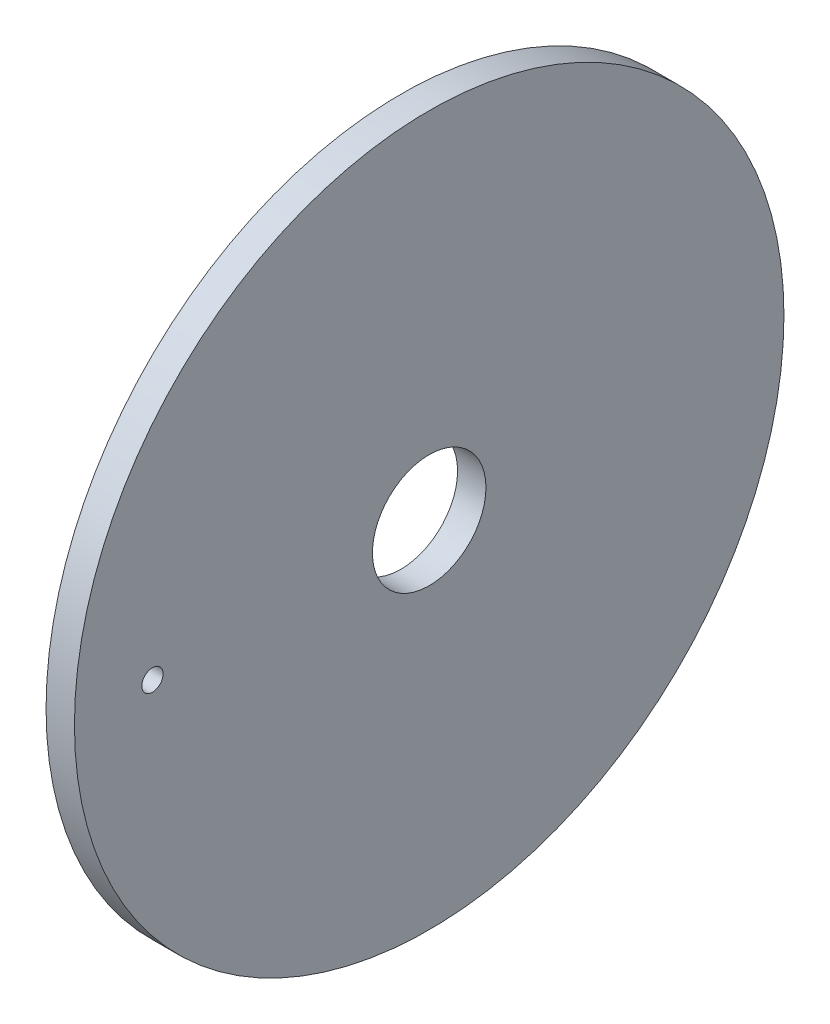
ISO-10303-21;
HEADER;
FILE_DESCRIPTION(('STEP AP214'),'2;1');
FILE_NAME('part.step','',(''),(''),'','','');
FILE_SCHEMA(('AUTOMOTIVE_DESIGN { 1 0 10303 214 1 1 1 1 }'));
ENDSEC;
DATA;
#1=APPLICATION_CONTEXT('core data for automotive mechanical design processes');
#2=APPLICATION_PROTOCOL_DEFINITION('international standard','automotive_design',2000,#1);
#3=PRODUCT_CONTEXT('',#1,'mechanical');
#4=PRODUCT('Part','Part','',(#3));
#5=PRODUCT_RELATED_PRODUCT_CATEGORY('part','',(#4));
#6=PRODUCT_DEFINITION_FORMATION('','',#4);
#7=PRODUCT_DEFINITION_CONTEXT('part definition',#1,'design');
#8=PRODUCT_DEFINITION('design','',#6,#7);
#9=PRODUCT_DEFINITION_SHAPE('','',#8);
#10=(LENGTH_UNIT() NAMED_UNIT(*) SI_UNIT(.MILLI.,.METRE.));
#11=(NAMED_UNIT(*) PLANE_ANGLE_UNIT() SI_UNIT($,.RADIAN.));
#12=(NAMED_UNIT(*) SI_UNIT($,.STERADIAN.) SOLID_ANGLE_UNIT());
#13=UNCERTAINTY_MEASURE_WITH_UNIT(LENGTH_MEASURE(1.E-05),#10,'distance_accuracy_value','');
#14=(GEOMETRIC_REPRESENTATION_CONTEXT(3) GLOBAL_UNCERTAINTY_ASSIGNED_CONTEXT((#13)) GLOBAL_UNIT_ASSIGNED_CONTEXT((#10,
#11,#12)) REPRESENTATION_CONTEXT('',''));
#15=CARTESIAN_POINT('',(0.,0.,0.));
#16=DIRECTION('',(0.,0.,1.));
#17=DIRECTION('',(1.,0.,0.));
#18=AXIS2_PLACEMENT_3D('',#15,#16,#17);
#19=CARTESIAN_POINT('',(2.,0.,0.));
#20=DIRECTION('',(1.,0.,0.));
#21=DIRECTION('',(0.,0.,-1.));
#22=AXIS2_PLACEMENT_3D('',#19,#20,#21);
#23=PLANE('',#22);
#24=CARTESIAN_POINT('',(2.,0.,19.5));
#25=DIRECTION('',(1.,0.,0.));
#26=DIRECTION('',(0.,0.,-1.));
#27=AXIS2_PLACEMENT_3D('',#24,#25,#26);
#28=CIRCLE('',#27,0.750000000000002);
#29=CARTESIAN_POINT('',(2.,0.,18.75));
#30=VERTEX_POINT('',#29);
#31=EDGE_CURVE('E50',#30,#30,#28,.T.);
#32=ORIENTED_EDGE('',*,*,#31,.F.);
#33=EDGE_LOOP('',(#32));
#34=FACE_BOUND('',#33,.T.);
#35=CARTESIAN_POINT('',(2.,0.,0.));
#36=DIRECTION('',(1.,0.,0.));
#37=DIRECTION('',(0.,0.,-1.));
#38=AXIS2_PLACEMENT_3D('',#35,#36,#37);
#39=CIRCLE('',#38,25.);
#40=CARTESIAN_POINT('',(2.,0.,-25.));
#41=VERTEX_POINT('',#40);
#42=EDGE_CURVE('E10',#41,#41,#39,.T.);
#43=ORIENTED_EDGE('',*,*,#42,.T.);
#44=EDGE_LOOP('',(#43));
#45=FACE_BOUND('',#44,.T.);
#46=CARTESIAN_POINT('',(2.,0.,0.));
#47=DIRECTION('',(1.,0.,0.));
#48=DIRECTION('',(0.,0.,-1.));
#49=AXIS2_PLACEMENT_3D('',#46,#47,#48);
#50=CIRCLE('',#49,4.);
#51=CARTESIAN_POINT('',(2.,0.,-4.));
#52=VERTEX_POINT('',#51);
#53=EDGE_CURVE('E45',#52,#52,#50,.T.);
#54=ORIENTED_EDGE('',*,*,#53,.F.);
#55=EDGE_LOOP('',(#54));
#56=FACE_BOUND('',#55,.T.);
#57=ADVANCED_FACE('F32',(#34,#45,#56),#23,.T.);
#58=CARTESIAN_POINT('',(0.,0.,0.));
#59=DIRECTION('',(1.,0.,0.));
#60=DIRECTION('',(0.,0.,-1.));
#61=AXIS2_PLACEMENT_3D('',#58,#59,#60);
#62=PLANE('',#61);
#63=CARTESIAN_POINT('',(0.,0.,19.5));
#64=DIRECTION('',(1.,0.,0.));
#65=DIRECTION('',(0.,0.,-1.));
#66=AXIS2_PLACEMENT_3D('',#63,#64,#65);
#67=CIRCLE('',#66,0.750000000000002);
#68=CARTESIAN_POINT('',(0.,0.,18.75));
#69=VERTEX_POINT('',#68);
#70=EDGE_CURVE('E36',#69,#69,#67,.T.);
#71=ORIENTED_EDGE('',*,*,#70,.T.);
#72=EDGE_LOOP('',(#71));
#73=FACE_BOUND('',#72,.T.);
#74=CARTESIAN_POINT('',(0.,0.,0.));
#75=DIRECTION('',(1.,0.,0.));
#76=DIRECTION('',(0.,0.,-1.));
#77=AXIS2_PLACEMENT_3D('',#74,#75,#76);
#78=CIRCLE('',#77,25.);
#79=CARTESIAN_POINT('',(0.,0.,-25.));
#80=VERTEX_POINT('',#79);
#81=EDGE_CURVE('E40',#80,#80,#78,.T.);
#82=ORIENTED_EDGE('',*,*,#81,.F.);
#83=EDGE_LOOP('',(#82));
#84=FACE_BOUND('',#83,.T.);
#85=CARTESIAN_POINT('',(0.,0.,0.));
#86=DIRECTION('',(1.,0.,0.));
#87=DIRECTION('',(0.,0.,-1.));
#88=AXIS2_PLACEMENT_3D('',#85,#86,#87);
#89=CIRCLE('',#88,4.);
#90=CARTESIAN_POINT('',(0.,0.,-4.));
#91=VERTEX_POINT('',#90);
#92=EDGE_CURVE('E47',#91,#91,#89,.T.);
#93=ORIENTED_EDGE('',*,*,#92,.T.);
#94=EDGE_LOOP('',(#93));
#95=FACE_BOUND('',#94,.T.);
#96=ADVANCED_FACE('F59',(#73,#84,#95),#62,.F.);
#97=CARTESIAN_POINT('',(2.,0.,0.));
#98=DIRECTION('',(-1.,0.,0.));
#99=DIRECTION('',(0.,0.,1.));
#100=AXIS2_PLACEMENT_3D('',#97,#98,#99);
#101=CYLINDRICAL_SURFACE('',#100,25.);
#102=ORIENTED_EDGE('',*,*,#42,.F.);
#103=EDGE_LOOP('',(#102));
#104=FACE_BOUND('',#103,.T.);
#105=ORIENTED_EDGE('',*,*,#81,.T.);
#106=EDGE_LOOP('',(#105));
#107=FACE_BOUND('',#106,.T.);
#108=ADVANCED_FACE('F34',(#104,#107),#101,.T.);
#109=CARTESIAN_POINT('',(2.,0.,0.));
#110=DIRECTION('',(-1.,0.,0.));
#111=DIRECTION('',(0.,0.,1.));
#112=AXIS2_PLACEMENT_3D('',#109,#110,#111);
#113=CYLINDRICAL_SURFACE('',#112,4.);
#114=ORIENTED_EDGE('',*,*,#53,.T.);
#115=EDGE_LOOP('',(#114));
#116=FACE_BOUND('',#115,.T.);
#117=ORIENTED_EDGE('',*,*,#92,.F.);
#118=EDGE_LOOP('',(#117));
#119=FACE_BOUND('',#118,.T.);
#120=ADVANCED_FACE('F64',(#116,#119),#113,.F.);
#121=CARTESIAN_POINT('',(-5.,0.,19.5));
#122=DIRECTION('',(1.,0.,0.));
#123=DIRECTION('',(0.,0.,-1.));
#124=AXIS2_PLACEMENT_3D('',#121,#122,#123);
#125=CYLINDRICAL_SURFACE('',#124,0.750000000000002);
#126=ORIENTED_EDGE('',*,*,#31,.T.);
#127=EDGE_LOOP('',(#126));
#128=FACE_BOUND('',#127,.T.);
#129=ORIENTED_EDGE('',*,*,#70,.F.);
#130=EDGE_LOOP('',(#129));
#131=FACE_BOUND('',#130,.T.);
#132=ADVANCED_FACE('F62',(#128,#131),#125,.F.);
#133=CLOSED_SHELL('',(#57,#96,#108,#120,#132));
#134=MANIFOLD_SOLID_BREP('B2',#133);
#135=ADVANCED_BREP_SHAPE_REPRESENTATION('',(#18,#134),#14);
#136=SHAPE_DEFINITION_REPRESENTATION(#9,#135);
ENDSEC;
END-ISO-10303-21;
